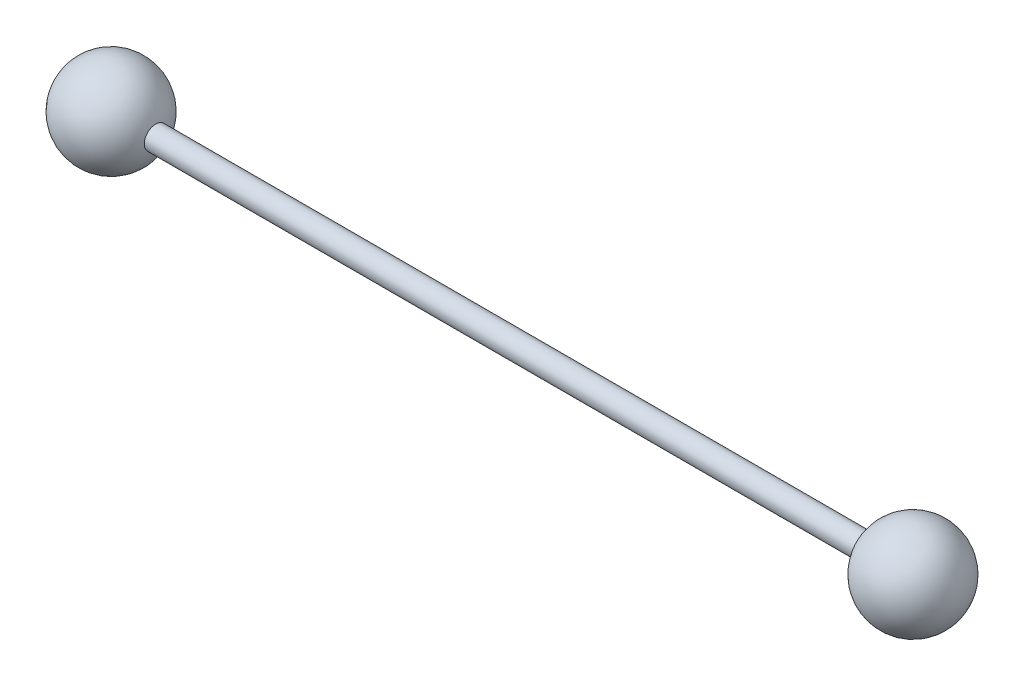
ISO-10303-21;
HEADER;
FILE_DESCRIPTION(('STEP AP214'),'2;1');
FILE_NAME('part.step','',(''),(''),'','','');
FILE_SCHEMA(('AUTOMOTIVE_DESIGN { 1 0 10303 214 1 1 1 1 }'));
ENDSEC;
DATA;
#1=APPLICATION_CONTEXT('core data for automotive mechanical design processes');
#2=APPLICATION_PROTOCOL_DEFINITION('international standard','automotive_design',2000,#1);
#3=PRODUCT_CONTEXT('',#1,'mechanical');
#4=PRODUCT('Part','Part','',(#3));
#5=PRODUCT_RELATED_PRODUCT_CATEGORY('part','',(#4));
#6=PRODUCT_DEFINITION_FORMATION('','',#4);
#7=PRODUCT_DEFINITION_CONTEXT('part definition',#1,'design');
#8=PRODUCT_DEFINITION('design','',#6,#7);
#9=PRODUCT_DEFINITION_SHAPE('','',#8);
#10=(LENGTH_UNIT() NAMED_UNIT(*) SI_UNIT(.MILLI.,.METRE.));
#11=(NAMED_UNIT(*) PLANE_ANGLE_UNIT() SI_UNIT($,.RADIAN.));
#12=(NAMED_UNIT(*) SI_UNIT($,.STERADIAN.) SOLID_ANGLE_UNIT());
#13=UNCERTAINTY_MEASURE_WITH_UNIT(LENGTH_MEASURE(1.E-05),#10,'distance_accuracy_value','');
#14=(GEOMETRIC_REPRESENTATION_CONTEXT(3) GLOBAL_UNCERTAINTY_ASSIGNED_CONTEXT((#13)) GLOBAL_UNIT_ASSIGNED_CONTEXT((#10,
#11,#12)) REPRESENTATION_CONTEXT('',''));
#15=CARTESIAN_POINT('',(0.,0.,0.));
#16=DIRECTION('',(0.,0.,1.));
#17=DIRECTION('',(1.,0.,0.));
#18=AXIS2_PLACEMENT_3D('',#15,#16,#17);
#19=CARTESIAN_POINT('',(44.45,0.,0.));
#20=DIRECTION('',(-1.,0.,0.));
#21=DIRECTION('',(0.,0.,1.));
#22=AXIS2_PLACEMENT_3D('',#19,#20,#21);
#23=CYLINDRICAL_SURFACE('',#22,1.27);
#24=CARTESIAN_POINT('',(-39.5050824920935,0.,0.));
#25=DIRECTION('',(-1.,0.,0.));
#26=DIRECTION('',(0.,0.,1.));
#27=AXIS2_PLACEMENT_3D('',#24,#25,#26);
#28=CIRCLE('',#27,1.27);
#29=CARTESIAN_POINT('',(-39.5050824920935,0.,1.27));
#30=VERTEX_POINT('',#29);
#31=EDGE_CURVE('E35',#30,#30,#28,.F.);
#32=ORIENTED_EDGE('',*,*,#31,.T.);
#33=EDGE_LOOP('',(#32));
#34=FACE_BOUND('',#33,.T.);
#35=CARTESIAN_POINT('',(39.5050824920935,0.,0.));
#36=DIRECTION('',(1.,0.,0.));
#37=DIRECTION('',(0.,0.,-1.));
#38=AXIS2_PLACEMENT_3D('',#35,#36,#37);
#39=CIRCLE('',#38,1.27);
#40=CARTESIAN_POINT('',(39.5050824920935,0.,-1.27));
#41=VERTEX_POINT('',#40);
#42=EDGE_CURVE('E10',#41,#41,#39,.T.);
#43=ORIENTED_EDGE('',*,*,#42,.F.);
#44=EDGE_LOOP('',(#43));
#45=FACE_BOUND('',#44,.T.);
#46=ADVANCED_FACE('F29',(#34,#45),#23,.T.);
#47=CARTESIAN_POINT('',(-44.45,0.,0.));
#48=DIRECTION('',(0.,1.,0.));
#49=DIRECTION('',(0.,0.,1.));
#50=AXIS2_PLACEMENT_3D('',#47,#48,#49);
#51=SPHERICAL_SURFACE('',#50,5.1054);
#52=CARTESIAN_POINT('',(-44.45,0.,0.));
#53=DIRECTION('',(-1.,0.,0.));
#54=DIRECTION('',(0.,0.,1.));
#55=AXIS2_PLACEMENT_3D('',#52,#53,#54);
#56=SPHERICAL_SURFACE('',#55,5.1054);
#57=ORIENTED_EDGE('',*,*,#31,.F.);
#58=EDGE_LOOP('',(#57));
#59=FACE_BOUND('',#58,.T.);
#60=ADVANCED_FACE('F43',(#59),#56,.T.);
#61=CARTESIAN_POINT('',(44.45,0.,0.));
#62=DIRECTION('',(0.,1.,0.));
#63=DIRECTION('',(0.,0.,-1.));
#64=AXIS2_PLACEMENT_3D('',#61,#62,#63);
#65=SPHERICAL_SURFACE('',#64,5.1054);
#66=CARTESIAN_POINT('',(44.45,0.,0.));
#67=DIRECTION('',(1.,0.,0.));
#68=DIRECTION('',(0.,0.,-1.));
#69=AXIS2_PLACEMENT_3D('',#66,#67,#68);
#70=SPHERICAL_SURFACE('',#69,5.1054);
#71=ORIENTED_EDGE('',*,*,#42,.T.);
#72=EDGE_LOOP('',(#71));
#73=FACE_BOUND('',#72,.T.);
#74=ADVANCED_FACE('F45',(#73),#70,.T.);
#75=CLOSED_SHELL('',(#46,#60,#74));
#76=MANIFOLD_SOLID_BREP('B2',#75);
#77=ADVANCED_BREP_SHAPE_REPRESENTATION('',(#18,#76),#14);
#78=SHAPE_DEFINITION_REPRESENTATION(#9,#77);
ENDSEC;
END-ISO-10303-21;
